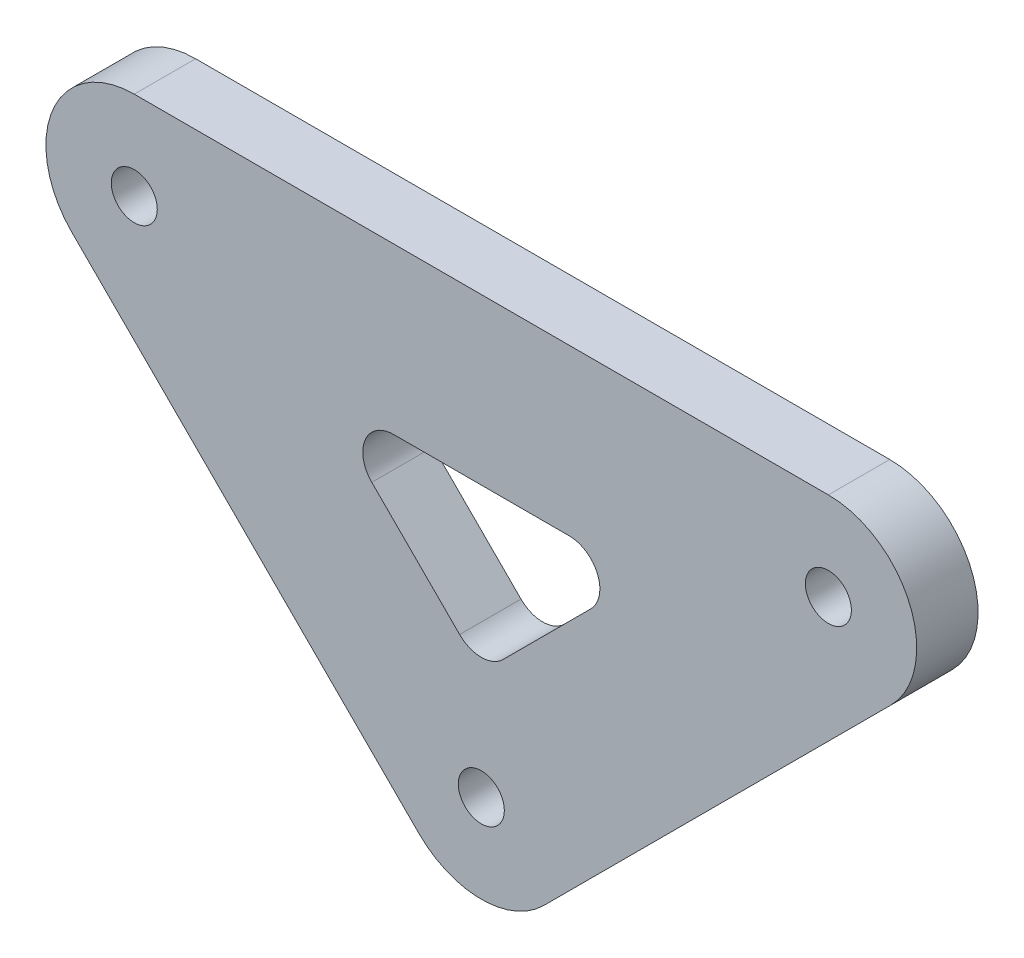
ISO-10303-21;
HEADER;
FILE_DESCRIPTION(('STEP AP214'),'2;1');
FILE_NAME('part.step','',(''),(''),'','','');
FILE_SCHEMA(('AUTOMOTIVE_DESIGN { 1 0 10303 214 1 1 1 1 }'));
ENDSEC;
DATA;
#1=APPLICATION_CONTEXT('core data for automotive mechanical design processes');
#2=APPLICATION_PROTOCOL_DEFINITION('international standard','automotive_design',2000,#1);
#3=PRODUCT_CONTEXT('',#1,'mechanical');
#4=PRODUCT('Part','Part','',(#3));
#5=PRODUCT_RELATED_PRODUCT_CATEGORY('part','',(#4));
#6=PRODUCT_DEFINITION_FORMATION('','',#4);
#7=PRODUCT_DEFINITION_CONTEXT('part definition',#1,'design');
#8=PRODUCT_DEFINITION('design','',#6,#7);
#9=PRODUCT_DEFINITION_SHAPE('','',#8);
#10=(LENGTH_UNIT() NAMED_UNIT(*) SI_UNIT(.MILLI.,.METRE.));
#11=(NAMED_UNIT(*) PLANE_ANGLE_UNIT() SI_UNIT($,.RADIAN.));
#12=(NAMED_UNIT(*) SI_UNIT($,.STERADIAN.) SOLID_ANGLE_UNIT());
#13=UNCERTAINTY_MEASURE_WITH_UNIT(LENGTH_MEASURE(1.E-05),#10,'distance_accuracy_value','');
#14=(GEOMETRIC_REPRESENTATION_CONTEXT(3) GLOBAL_UNCERTAINTY_ASSIGNED_CONTEXT((#13)) GLOBAL_UNIT_ASSIGNED_CONTEXT((#10,
#11,#12)) REPRESENTATION_CONTEXT('',''));
#15=CARTESIAN_POINT('',(0.,0.,0.));
#16=DIRECTION('',(0.,0.,1.));
#17=DIRECTION('',(1.,0.,0.));
#18=AXIS2_PLACEMENT_3D('',#15,#16,#17);
#19=CARTESIAN_POINT('',(0.,0.,4.));
#20=DIRECTION('',(0.,0.,1.));
#21=DIRECTION('',(1.,0.,0.));
#22=AXIS2_PLACEMENT_3D('',#19,#20,#21);
#23=PLANE('',#22);
#24=CARTESIAN_POINT('',(22.6274169979695,22.6274169979695,4.));
#25=DIRECTION('',(0.,0.,1.));
#26=DIRECTION('',(1.,0.,0.));
#27=AXIS2_PLACEMENT_3D('',#24,#25,#26);
#28=CIRCLE('',#27,1.5);
#29=CARTESIAN_POINT('',(24.1274169979695,22.6274169979695,4.));
#30=VERTEX_POINT('',#29);
#31=EDGE_CURVE('E155',#30,#30,#28,.T.);
#32=ORIENTED_EDGE('',*,*,#31,.F.);
#33=EDGE_LOOP('',(#32));
#34=FACE_BOUND('',#33,.T.);
#35=CARTESIAN_POINT('',(0.,0.,4.));
#36=DIRECTION('',(0.,0.,1.));
#37=DIRECTION('',(1.,0.,0.));
#38=AXIS2_PLACEMENT_3D('',#35,#36,#37);
#39=CIRCLE('',#38,1.5);
#40=CARTESIAN_POINT('',(1.49999999999999,0.,4.));
#41=VERTEX_POINT('',#40);
#42=EDGE_CURVE('E175',#41,#41,#39,.T.);
#43=ORIENTED_EDGE('',*,*,#42,.F.);
#44=EDGE_LOOP('',(#43));
#45=FACE_BOUND('',#44,.T.);
#46=CARTESIAN_POINT('',(0.,0.,4.));
#47=DIRECTION('',(0.,0.,1.));
#48=DIRECTION('',(1.,0.,0.));
#49=AXIS2_PLACEMENT_3D('',#46,#47,#48);
#50=CIRCLE('',#49,5.7605596096755);
#51=CARTESIAN_POINT('',(-4.07333076343089,-4.07333076343089,4.));
#52=VERTEX_POINT('',#51);
#53=CARTESIAN_POINT('',(4.07333076343086,-4.07333076343089,4.));
#54=VERTEX_POINT('',#53);
#55=EDGE_CURVE('E181',#52,#54,#50,.T.);
#56=ORIENTED_EDGE('',*,*,#55,.T.);
#57=DIRECTION('',(0.707106781186547,0.707106781186547,0.));
#58=VECTOR('',#57,1.);
#59=CARTESIAN_POINT('',(4.07333076343086,-4.07333076343089,4.));
#60=LINE('',#59,#58);
#61=CARTESIAN_POINT('',(26.7007477614004,18.5540862345386,4.));
#62=VERTEX_POINT('',#61);
#63=EDGE_CURVE('E184',#54,#62,#60,.T.);
#64=ORIENTED_EDGE('',*,*,#63,.T.);
#65=CARTESIAN_POINT('',(22.6274169979695,22.6274169979695,4.));
#66=DIRECTION('',(0.,0.,1.));
#67=DIRECTION('',(-1.,0.,0.));
#68=AXIS2_PLACEMENT_3D('',#65,#66,#67);
#69=CIRCLE('',#68,5.7605596096755);
#70=CARTESIAN_POINT('',(22.6274169979695,28.387976607645,4.));
#71=VERTEX_POINT('',#70);
#72=EDGE_CURVE('E187',#62,#71,#69,.T.);
#73=ORIENTED_EDGE('',*,*,#72,.T.);
#74=DIRECTION('',(-1.,0.,0.));
#75=VECTOR('',#74,1.);
#76=CARTESIAN_POINT('',(22.6274169979695,28.387976607645,4.));
#77=LINE('',#76,#75);
#78=CARTESIAN_POINT('',(-22.6274169979695,28.387976607645,4.));
#79=VERTEX_POINT('',#78);
#80=EDGE_CURVE('E189',#71,#79,#77,.T.);
#81=ORIENTED_EDGE('',*,*,#80,.T.);
#82=CARTESIAN_POINT('',(-22.6274169979695,22.6274169979695,4.));
#83=DIRECTION('',(0.,0.,1.));
#84=DIRECTION('',(-1.,0.,0.));
#85=AXIS2_PLACEMENT_3D('',#82,#83,#84);
#86=CIRCLE('',#85,5.7605596096755);
#87=CARTESIAN_POINT('',(-26.7007477614004,18.5540862345386,4.));
#88=VERTEX_POINT('',#87);
#89=EDGE_CURVE('E191',#79,#88,#86,.T.);
#90=ORIENTED_EDGE('',*,*,#89,.T.);
#91=DIRECTION('',(0.707106781186548,-0.707106781186547,0.));
#92=VECTOR('',#91,1.);
#93=CARTESIAN_POINT('',(-26.7007477614004,18.5540862345386,4.));
#94=LINE('',#93,#92);
#95=EDGE_CURVE('E193',#88,#52,#94,.T.);
#96=ORIENTED_EDGE('',*,*,#95,.T.);
#97=EDGE_LOOP('',(#56,#64,#73,#81,#90,#96));
#98=FACE_BOUND('',#97,.T.);
#99=DIRECTION('',(0.707106781186547,0.707106781186548,0.));
#100=VECTOR('',#99,1.);
#101=CARTESIAN_POINT('',(1.41421356237311,8.48528137423858,4.));
#102=LINE('',#101,#100);
#103=CARTESIAN_POINT('',(1.41421356237311,8.48528137423858,4.));
#104=VERTEX_POINT('',#103);
#105=CARTESIAN_POINT('',(7.14213562373092,14.2132034355964,4.));
#106=VERTEX_POINT('',#105);
#107=EDGE_CURVE('E129',#104,#106,#102,.T.);
#108=ORIENTED_EDGE('',*,*,#107,.F.);
#109=CARTESIAN_POINT('',(0.,9.89949493661167,4.));
#110=DIRECTION('',(0.,0.,1.));
#111=DIRECTION('',(1.,0.,0.));
#112=AXIS2_PLACEMENT_3D('',#109,#110,#111);
#113=CIRCLE('',#112,2.);
#114=CARTESIAN_POINT('',(-1.41421356237311,8.48528137423858,4.));
#115=VERTEX_POINT('',#114);
#116=EDGE_CURVE('E121',#115,#104,#113,.T.);
#117=ORIENTED_EDGE('',*,*,#116,.F.);
#118=DIRECTION('',(0.707106781186547,-0.707106781186548,0.));
#119=VECTOR('',#118,1.);
#120=CARTESIAN_POINT('',(-7.14213562373092,14.2132034355964,4.));
#121=LINE('',#120,#119);
#122=CARTESIAN_POINT('',(-7.14213562373092,14.2132034355964,4.));
#123=VERTEX_POINT('',#122);
#124=EDGE_CURVE('E152',#123,#115,#121,.T.);
#125=ORIENTED_EDGE('',*,*,#124,.F.);
#126=CARTESIAN_POINT('',(-5.72792206135786,15.6274169979695,4.));
#127=DIRECTION('',(0.,0.,1.));
#128=DIRECTION('',(1.,0.,0.));
#129=AXIS2_PLACEMENT_3D('',#126,#127,#128);
#130=CIRCLE('',#129,2.);
#131=CARTESIAN_POINT('',(-5.72792206135781,17.6274169979695,4.));
#132=VERTEX_POINT('',#131);
#133=EDGE_CURVE('E150',#132,#123,#130,.T.);
#134=ORIENTED_EDGE('',*,*,#133,.F.);
#135=DIRECTION('',(-1.,0.,0.));
#136=VECTOR('',#135,1.);
#137=CARTESIAN_POINT('',(5.72792206135781,17.6274169979695,4.));
#138=LINE('',#137,#136);
#139=CARTESIAN_POINT('',(5.72792206135781,17.6274169979695,4.));
#140=VERTEX_POINT('',#139);
#141=EDGE_CURVE('E145',#140,#132,#138,.T.);
#142=ORIENTED_EDGE('',*,*,#141,.F.);
#143=CARTESIAN_POINT('',(5.72792206135786,15.6274169979695,4.));
#144=DIRECTION('',(0.,0.,1.));
#145=DIRECTION('',(-1.,0.,0.));
#146=AXIS2_PLACEMENT_3D('',#143,#144,#145);
#147=CIRCLE('',#146,2.);
#148=EDGE_CURVE('E143',#106,#140,#147,.T.);
#149=ORIENTED_EDGE('',*,*,#148,.F.);
#150=EDGE_LOOP('',(#108,#117,#125,#134,#142,#149));
#151=FACE_BOUND('',#150,.T.);
#152=CARTESIAN_POINT('',(-22.6274169979695,22.6274169979695,4.));
#153=DIRECTION('',(0.,0.,1.));
#154=DIRECTION('',(1.,0.,0.));
#155=AXIS2_PLACEMENT_3D('',#152,#153,#154);
#156=CIRCLE('',#155,1.5);
#157=CARTESIAN_POINT('',(-21.1274169979695,22.6274169979695,4.));
#158=VERTEX_POINT('',#157);
#159=EDGE_CURVE('E301',#158,#158,#156,.T.);
#160=ORIENTED_EDGE('',*,*,#159,.F.);
#161=EDGE_LOOP('',(#160));
#162=FACE_BOUND('',#161,.T.);
#163=ADVANCED_FACE('F32',(#34,#45,#98,#151,#162),#23,.T.);
#164=CARTESIAN_POINT('',(0.,0.,0.));
#165=DIRECTION('',(0.,0.,1.));
#166=DIRECTION('',(1.,0.,0.));
#167=AXIS2_PLACEMENT_3D('',#164,#165,#166);
#168=PLANE('',#167);
#169=CARTESIAN_POINT('',(22.6274169979695,22.6274169979695,0.));
#170=DIRECTION('',(0.,0.,1.));
#171=DIRECTION('',(1.,0.,0.));
#172=AXIS2_PLACEMENT_3D('',#169,#170,#171);
#173=CIRCLE('',#172,1.5);
#174=CARTESIAN_POINT('',(24.1274169979695,22.6274169979695,0.));
#175=VERTEX_POINT('',#174);
#176=EDGE_CURVE('E307',#175,#175,#173,.T.);
#177=ORIENTED_EDGE('',*,*,#176,.T.);
#178=EDGE_LOOP('',(#177));
#179=FACE_BOUND('',#178,.T.);
#180=CARTESIAN_POINT('',(0.,0.,0.));
#181=DIRECTION('',(0.,0.,1.));
#182=DIRECTION('',(1.,0.,0.));
#183=AXIS2_PLACEMENT_3D('',#180,#181,#182);
#184=CIRCLE('',#183,1.5);
#185=CARTESIAN_POINT('',(1.49999999999999,0.,0.));
#186=VERTEX_POINT('',#185);
#187=EDGE_CURVE('E137',#186,#186,#184,.T.);
#188=ORIENTED_EDGE('',*,*,#187,.T.);
#189=EDGE_LOOP('',(#188));
#190=FACE_BOUND('',#189,.T.);
#191=CARTESIAN_POINT('',(0.,0.,0.));
#192=DIRECTION('',(0.,0.,1.));
#193=DIRECTION('',(1.,0.,0.));
#194=AXIS2_PLACEMENT_3D('',#191,#192,#193);
#195=CIRCLE('',#194,5.7605596096755);
#196=CARTESIAN_POINT('',(-4.07333076343089,-4.07333076343089,0.));
#197=VERTEX_POINT('',#196);
#198=CARTESIAN_POINT('',(4.07333076343086,-4.07333076343089,0.));
#199=VERTEX_POINT('',#198);
#200=EDGE_CURVE('E178',#197,#199,#195,.T.);
#201=ORIENTED_EDGE('',*,*,#200,.F.);
#202=DIRECTION('',(0.707106781186548,-0.707106781186547,0.));
#203=VECTOR('',#202,1.);
#204=CARTESIAN_POINT('',(-26.7007477614004,18.5540862345386,0.));
#205=LINE('',#204,#203);
#206=CARTESIAN_POINT('',(-26.7007477614004,18.5540862345386,0.));
#207=VERTEX_POINT('',#206);
#208=EDGE_CURVE('E185',#207,#197,#205,.T.);
#209=ORIENTED_EDGE('',*,*,#208,.F.);
#210=CARTESIAN_POINT('',(-22.6274169979695,22.6274169979695,0.));
#211=DIRECTION('',(0.,0.,1.));
#212=DIRECTION('',(-1.,0.,0.));
#213=AXIS2_PLACEMENT_3D('',#210,#211,#212);
#214=CIRCLE('',#213,5.7605596096755);
#215=CARTESIAN_POINT('',(-22.6274169979695,28.387976607645,0.));
#216=VERTEX_POINT('',#215);
#217=EDGE_CURVE('E204',#216,#207,#214,.T.);
#218=ORIENTED_EDGE('',*,*,#217,.F.);
#219=DIRECTION('',(-1.,0.,0.));
#220=VECTOR('',#219,1.);
#221=CARTESIAN_POINT('',(22.6274169979695,28.387976607645,0.));
#222=LINE('',#221,#220);
#223=CARTESIAN_POINT('',(22.6274169979695,28.387976607645,0.));
#224=VERTEX_POINT('',#223);
#225=EDGE_CURVE('E202',#224,#216,#222,.T.);
#226=ORIENTED_EDGE('',*,*,#225,.F.);
#227=CARTESIAN_POINT('',(22.6274169979695,22.6274169979695,0.));
#228=DIRECTION('',(0.,0.,1.));
#229=DIRECTION('',(-1.,0.,0.));
#230=AXIS2_PLACEMENT_3D('',#227,#228,#229);
#231=CIRCLE('',#230,5.7605596096755);
#232=CARTESIAN_POINT('',(26.7007477614004,18.5540862345386,0.));
#233=VERTEX_POINT('',#232);
#234=EDGE_CURVE('E200',#233,#224,#231,.T.);
#235=ORIENTED_EDGE('',*,*,#234,.F.);
#236=DIRECTION('',(0.707106781186547,0.707106781186547,0.));
#237=VECTOR('',#236,1.);
#238=CARTESIAN_POINT('',(4.07333076343086,-4.07333076343089,0.));
#239=LINE('',#238,#237);
#240=EDGE_CURVE('E198',#199,#233,#239,.T.);
#241=ORIENTED_EDGE('',*,*,#240,.F.);
#242=EDGE_LOOP('',(#201,#209,#218,#226,#235,#241));
#243=FACE_BOUND('',#242,.T.);
#244=CARTESIAN_POINT('',(0.,9.89949493661167,0.));
#245=DIRECTION('',(0.,0.,1.));
#246=DIRECTION('',(1.,0.,0.));
#247=AXIS2_PLACEMENT_3D('',#244,#245,#246);
#248=CIRCLE('',#247,2.);
#249=CARTESIAN_POINT('',(-1.41421356237311,8.48528137423858,0.));
#250=VERTEX_POINT('',#249);
#251=CARTESIAN_POINT('',(1.41421356237311,8.48528137423858,0.));
#252=VERTEX_POINT('',#251);
#253=EDGE_CURVE('E55',#250,#252,#248,.T.);
#254=ORIENTED_EDGE('',*,*,#253,.T.);
#255=DIRECTION('',(0.707106781186547,0.707106781186548,0.));
#256=VECTOR('',#255,1.);
#257=CARTESIAN_POINT('',(1.41421356237311,8.48528137423858,0.));
#258=LINE('',#257,#256);
#259=CARTESIAN_POINT('',(7.14213562373092,14.2132034355964,0.));
#260=VERTEX_POINT('',#259);
#261=EDGE_CURVE('E136',#252,#260,#258,.T.);
#262=ORIENTED_EDGE('',*,*,#261,.T.);
#263=CARTESIAN_POINT('',(5.72792206135786,15.6274169979695,0.));
#264=DIRECTION('',(0.,0.,1.));
#265=DIRECTION('',(-1.,0.,0.));
#266=AXIS2_PLACEMENT_3D('',#263,#264,#265);
#267=CIRCLE('',#266,2.);
#268=CARTESIAN_POINT('',(5.72792206135781,17.6274169979695,0.));
#269=VERTEX_POINT('',#268);
#270=EDGE_CURVE('E157',#260,#269,#267,.T.);
#271=ORIENTED_EDGE('',*,*,#270,.T.);
#272=DIRECTION('',(-1.,0.,0.));
#273=VECTOR('',#272,1.);
#274=CARTESIAN_POINT('',(5.72792206135781,17.6274169979695,0.));
#275=LINE('',#274,#273);
#276=CARTESIAN_POINT('',(-5.72792206135781,17.6274169979695,0.));
#277=VERTEX_POINT('',#276);
#278=EDGE_CURVE('E160',#269,#277,#275,.T.);
#279=ORIENTED_EDGE('',*,*,#278,.T.);
#280=CARTESIAN_POINT('',(-5.72792206135786,15.6274169979695,0.));
#281=DIRECTION('',(0.,0.,1.));
#282=DIRECTION('',(1.,0.,0.));
#283=AXIS2_PLACEMENT_3D('',#280,#281,#282);
#284=CIRCLE('',#283,2.);
#285=CARTESIAN_POINT('',(-7.14213562373092,14.2132034355964,0.));
#286=VERTEX_POINT('',#285);
#287=EDGE_CURVE('E163',#277,#286,#284,.T.);
#288=ORIENTED_EDGE('',*,*,#287,.T.);
#289=DIRECTION('',(0.707106781186547,-0.707106781186548,0.));
#290=VECTOR('',#289,1.);
#291=CARTESIAN_POINT('',(-7.14213562373092,14.2132034355964,0.));
#292=LINE('',#291,#290);
#293=EDGE_CURVE('E130',#286,#250,#292,.T.);
#294=ORIENTED_EDGE('',*,*,#293,.T.);
#295=EDGE_LOOP('',(#254,#262,#271,#279,#288,#294));
#296=FACE_BOUND('',#295,.T.);
#297=CARTESIAN_POINT('',(-22.6274169979695,22.6274169979695,0.));
#298=DIRECTION('',(0.,0.,1.));
#299=DIRECTION('',(1.,0.,0.));
#300=AXIS2_PLACEMENT_3D('',#297,#298,#299);
#301=CIRCLE('',#300,1.5);
#302=CARTESIAN_POINT('',(-21.1274169979695,22.6274169979695,0.));
#303=VERTEX_POINT('',#302);
#304=EDGE_CURVE('E304',#303,#303,#301,.T.);
#305=ORIENTED_EDGE('',*,*,#304,.T.);
#306=EDGE_LOOP('',(#305));
#307=FACE_BOUND('',#306,.T.);
#308=ADVANCED_FACE('F228',(#179,#190,#243,#296,#307),#168,.F.);
#309=CARTESIAN_POINT('',(0.,0.,4.));
#310=DIRECTION('',(0.,0.,-1.));
#311=DIRECTION('',(-1.,0.,0.));
#312=AXIS2_PLACEMENT_3D('',#309,#310,#311);
#313=CYLINDRICAL_SURFACE('',#312,5.7605596096755);
#314=ORIENTED_EDGE('',*,*,#200,.T.);
#315=DIRECTION('',(0.,0.,-1.));
#316=VECTOR('',#315,1.);
#317=CARTESIAN_POINT('',(4.07333076343086,-4.07333076343089,4.));
#318=LINE('',#317,#316);
#319=EDGE_CURVE('E11',#54,#199,#318,.T.);
#320=ORIENTED_EDGE('',*,*,#319,.F.);
#321=ORIENTED_EDGE('',*,*,#55,.F.);
#322=DIRECTION('',(0.,0.,-1.));
#323=VECTOR('',#322,1.);
#324=CARTESIAN_POINT('',(-4.07333076343089,-4.07333076343089,4.));
#325=LINE('',#324,#323);
#326=EDGE_CURVE('E195',#52,#197,#325,.T.);
#327=ORIENTED_EDGE('',*,*,#326,.T.);
#328=EDGE_LOOP('',(#314,#320,#321,#327));
#329=FACE_BOUND('',#328,.T.);
#330=ADVANCED_FACE('F34',(#329),#313,.T.);
#331=CARTESIAN_POINT('',(4.07333076343086,-4.07333076343089,4.));
#332=DIRECTION('',(-0.707106781186547,0.707106781186547,0.));
#333=DIRECTION('',(-0.707106781186548,-0.707106781186548,0.));
#334=AXIS2_PLACEMENT_3D('',#331,#332,#333);
#335=PLANE('',#334);
#336=ORIENTED_EDGE('',*,*,#240,.T.);
#337=DIRECTION('',(0.,0.,-1.));
#338=VECTOR('',#337,1.);
#339=CARTESIAN_POINT('',(26.7007477614004,18.5540862345386,4.));
#340=LINE('',#339,#338);
#341=EDGE_CURVE('E40',#62,#233,#340,.T.);
#342=ORIENTED_EDGE('',*,*,#341,.F.);
#343=ORIENTED_EDGE('',*,*,#63,.F.);
#344=ORIENTED_EDGE('',*,*,#319,.T.);
#345=EDGE_LOOP('',(#336,#342,#343,#344));
#346=FACE_BOUND('',#345,.T.);
#347=ADVANCED_FACE('F245',(#346),#335,.F.);
#348=CARTESIAN_POINT('',(22.6274169979695,22.6274169979695,4.));
#349=DIRECTION('',(0.,0.,-1.));
#350=DIRECTION('',(-1.,0.,0.));
#351=AXIS2_PLACEMENT_3D('',#348,#349,#350);
#352=CYLINDRICAL_SURFACE('',#351,5.7605596096755);
#353=ORIENTED_EDGE('',*,*,#234,.T.);
#354=DIRECTION('',(0.,0.,-1.));
#355=VECTOR('',#354,1.);
#356=CARTESIAN_POINT('',(22.6274169979695,28.387976607645,4.));
#357=LINE('',#356,#355);
#358=EDGE_CURVE('E215',#71,#224,#357,.T.);
#359=ORIENTED_EDGE('',*,*,#358,.F.);
#360=ORIENTED_EDGE('',*,*,#72,.F.);
#361=ORIENTED_EDGE('',*,*,#341,.T.);
#362=EDGE_LOOP('',(#353,#359,#360,#361));
#363=FACE_BOUND('',#362,.T.);
#364=ADVANCED_FACE('F222',(#363),#352,.T.);
#365=CARTESIAN_POINT('',(22.6274169979695,28.387976607645,4.));
#366=DIRECTION('',(0.,-1.,0.));
#367=DIRECTION('',(1.,0.,0.));
#368=AXIS2_PLACEMENT_3D('',#365,#366,#367);
#369=PLANE('',#368);
#370=ORIENTED_EDGE('',*,*,#225,.T.);
#371=DIRECTION('',(0.,0.,-1.));
#372=VECTOR('',#371,1.);
#373=CARTESIAN_POINT('',(-22.6274169979695,28.387976607645,4.));
#374=LINE('',#373,#372);
#375=EDGE_CURVE('E212',#79,#216,#374,.T.);
#376=ORIENTED_EDGE('',*,*,#375,.F.);
#377=ORIENTED_EDGE('',*,*,#80,.F.);
#378=ORIENTED_EDGE('',*,*,#358,.T.);
#379=EDGE_LOOP('',(#370,#376,#377,#378));
#380=FACE_BOUND('',#379,.T.);
#381=ADVANCED_FACE('F234',(#380),#369,.F.);
#382=CARTESIAN_POINT('',(-22.6274169979695,22.6274169979695,4.));
#383=DIRECTION('',(0.,0.,-1.));
#384=DIRECTION('',(-1.,0.,0.));
#385=AXIS2_PLACEMENT_3D('',#382,#383,#384);
#386=CYLINDRICAL_SURFACE('',#385,5.7605596096755);
#387=ORIENTED_EDGE('',*,*,#217,.T.);
#388=DIRECTION('',(0.,0.,-1.));
#389=VECTOR('',#388,1.);
#390=CARTESIAN_POINT('',(-26.7007477614004,18.5540862345386,4.));
#391=LINE('',#390,#389);
#392=EDGE_CURVE('E209',#88,#207,#391,.T.);
#393=ORIENTED_EDGE('',*,*,#392,.F.);
#394=ORIENTED_EDGE('',*,*,#89,.F.);
#395=ORIENTED_EDGE('',*,*,#375,.T.);
#396=EDGE_LOOP('',(#387,#393,#394,#395));
#397=FACE_BOUND('',#396,.T.);
#398=ADVANCED_FACE('F238',(#397),#386,.T.);
#399=CARTESIAN_POINT('',(-26.7007477614004,18.5540862345386,4.));
#400=DIRECTION('',(0.707106781186547,0.707106781186548,0.));
#401=DIRECTION('',(-0.707106781186548,0.707106781186547,0.));
#402=AXIS2_PLACEMENT_3D('',#399,#400,#401);
#403=PLANE('',#402);
#404=ORIENTED_EDGE('',*,*,#208,.T.);
#405=ORIENTED_EDGE('',*,*,#326,.F.);
#406=ORIENTED_EDGE('',*,*,#95,.F.);
#407=ORIENTED_EDGE('',*,*,#392,.T.);
#408=EDGE_LOOP('',(#404,#405,#406,#407));
#409=FACE_BOUND('',#408,.T.);
#410=ADVANCED_FACE('F248',(#409),#403,.F.);
#411=CARTESIAN_POINT('',(0.,0.,4.));
#412=DIRECTION('',(0.,0.,-1.));
#413=DIRECTION('',(-1.,0.,0.));
#414=AXIS2_PLACEMENT_3D('',#411,#412,#413);
#415=CYLINDRICAL_SURFACE('',#414,1.5);
#416=ORIENTED_EDGE('',*,*,#42,.T.);
#417=EDGE_LOOP('',(#416));
#418=FACE_BOUND('',#417,.T.);
#419=ORIENTED_EDGE('',*,*,#187,.F.);
#420=EDGE_LOOP('',(#419));
#421=FACE_BOUND('',#420,.T.);
#422=ADVANCED_FACE('F250',(#418,#421),#415,.F.);
#423=CARTESIAN_POINT('',(0.,9.89949493661167,4.));
#424=DIRECTION('',(0.,0.,-1.));
#425=DIRECTION('',(-1.,0.,0.));
#426=AXIS2_PLACEMENT_3D('',#423,#424,#425);
#427=CYLINDRICAL_SURFACE('',#426,2.);
#428=ORIENTED_EDGE('',*,*,#253,.F.);
#429=DIRECTION('',(0.,0.,-1.));
#430=VECTOR('',#429,1.);
#431=CARTESIAN_POINT('',(-1.41421356237311,8.48528137423858,4.));
#432=LINE('',#431,#430);
#433=EDGE_CURVE('E125',#115,#250,#432,.T.);
#434=ORIENTED_EDGE('',*,*,#433,.F.);
#435=ORIENTED_EDGE('',*,*,#116,.T.);
#436=DIRECTION('',(0.,0.,-1.));
#437=VECTOR('',#436,1.);
#438=CARTESIAN_POINT('',(1.41421356237311,8.48528137423858,4.));
#439=LINE('',#438,#437);
#440=EDGE_CURVE('E124',#104,#252,#439,.T.);
#441=ORIENTED_EDGE('',*,*,#440,.T.);
#442=EDGE_LOOP('',(#428,#434,#435,#441));
#443=FACE_BOUND('',#442,.T.);
#444=ADVANCED_FACE('F123',(#443),#427,.F.);
#445=CARTESIAN_POINT('',(1.41421356237311,8.48528137423858,4.));
#446=DIRECTION('',(-0.707106781186548,0.707106781186547,0.));
#447=DIRECTION('',(-0.707106781186547,-0.707106781186548,0.));
#448=AXIS2_PLACEMENT_3D('',#445,#446,#447);
#449=PLANE('',#448);
#450=ORIENTED_EDGE('',*,*,#261,.F.);
#451=ORIENTED_EDGE('',*,*,#440,.F.);
#452=ORIENTED_EDGE('',*,*,#107,.T.);
#453=DIRECTION('',(0.,0.,-1.));
#454=VECTOR('',#453,1.);
#455=CARTESIAN_POINT('',(7.14213562373092,14.2132034355964,4.));
#456=LINE('',#455,#454);
#457=EDGE_CURVE('E138',#106,#260,#456,.T.);
#458=ORIENTED_EDGE('',*,*,#457,.T.);
#459=EDGE_LOOP('',(#450,#451,#452,#458));
#460=FACE_BOUND('',#459,.T.);
#461=ADVANCED_FACE('F133',(#460),#449,.T.);
#462=CARTESIAN_POINT('',(5.72792206135786,15.6274169979695,4.));
#463=DIRECTION('',(0.,0.,-1.));
#464=DIRECTION('',(-1.,0.,0.));
#465=AXIS2_PLACEMENT_3D('',#462,#463,#464);
#466=CYLINDRICAL_SURFACE('',#465,2.);
#467=ORIENTED_EDGE('',*,*,#270,.F.);
#468=ORIENTED_EDGE('',*,*,#457,.F.);
#469=ORIENTED_EDGE('',*,*,#148,.T.);
#470=DIRECTION('',(0.,0.,-1.));
#471=VECTOR('',#470,1.);
#472=CARTESIAN_POINT('',(5.72792206135781,17.6274169979695,4.));
#473=LINE('',#472,#471);
#474=EDGE_CURVE('E172',#140,#269,#473,.T.);
#475=ORIENTED_EDGE('',*,*,#474,.T.);
#476=EDGE_LOOP('',(#467,#468,#469,#475));
#477=FACE_BOUND('',#476,.T.);
#478=ADVANCED_FACE('F274',(#477),#466,.F.);
#479=CARTESIAN_POINT('',(5.72792206135781,17.6274169979695,4.));
#480=DIRECTION('',(0.,-1.,0.));
#481=DIRECTION('',(0.,0.,-1.));
#482=AXIS2_PLACEMENT_3D('',#479,#480,#481);
#483=PLANE('',#482);
#484=ORIENTED_EDGE('',*,*,#278,.F.);
#485=ORIENTED_EDGE('',*,*,#474,.F.);
#486=ORIENTED_EDGE('',*,*,#141,.T.);
#487=DIRECTION('',(0.,0.,-1.));
#488=VECTOR('',#487,1.);
#489=CARTESIAN_POINT('',(-5.72792206135781,17.6274169979695,4.));
#490=LINE('',#489,#488);
#491=EDGE_CURVE('E170',#132,#277,#490,.T.);
#492=ORIENTED_EDGE('',*,*,#491,.T.);
#493=EDGE_LOOP('',(#484,#485,#486,#492));
#494=FACE_BOUND('',#493,.T.);
#495=ADVANCED_FACE('F277',(#494),#483,.T.);
#496=CARTESIAN_POINT('',(-5.72792206135786,15.6274169979695,4.));
#497=DIRECTION('',(0.,0.,-1.));
#498=DIRECTION('',(-1.,0.,0.));
#499=AXIS2_PLACEMENT_3D('',#496,#497,#498);
#500=CYLINDRICAL_SURFACE('',#499,2.);
#501=ORIENTED_EDGE('',*,*,#287,.F.);
#502=ORIENTED_EDGE('',*,*,#491,.F.);
#503=ORIENTED_EDGE('',*,*,#133,.T.);
#504=DIRECTION('',(0.,0.,-1.));
#505=VECTOR('',#504,1.);
#506=CARTESIAN_POINT('',(-7.14213562373092,14.2132034355964,4.));
#507=LINE('',#506,#505);
#508=EDGE_CURVE('E47',#123,#286,#507,.T.);
#509=ORIENTED_EDGE('',*,*,#508,.T.);
#510=EDGE_LOOP('',(#501,#502,#503,#509));
#511=FACE_BOUND('',#510,.T.);
#512=ADVANCED_FACE('F281',(#511),#500,.F.);
#513=CARTESIAN_POINT('',(-7.14213562373092,14.2132034355964,4.));
#514=DIRECTION('',(0.707106781186548,0.707106781186547,0.));
#515=DIRECTION('',(-0.707106781186547,0.707106781186548,0.));
#516=AXIS2_PLACEMENT_3D('',#513,#514,#515);
#517=PLANE('',#516);
#518=ORIENTED_EDGE('',*,*,#293,.F.);
#519=ORIENTED_EDGE('',*,*,#508,.F.);
#520=ORIENTED_EDGE('',*,*,#124,.T.);
#521=ORIENTED_EDGE('',*,*,#433,.T.);
#522=EDGE_LOOP('',(#518,#519,#520,#521));
#523=FACE_BOUND('',#522,.T.);
#524=ADVANCED_FACE('F285',(#523),#517,.T.);
#525=CARTESIAN_POINT('',(22.6274169979695,22.6274169979695,4.));
#526=DIRECTION('',(0.,0.,-1.));
#527=DIRECTION('',(-1.,0.,0.));
#528=AXIS2_PLACEMENT_3D('',#525,#526,#527);
#529=CYLINDRICAL_SURFACE('',#528,1.5);
#530=ORIENTED_EDGE('',*,*,#31,.T.);
#531=EDGE_LOOP('',(#530));
#532=FACE_BOUND('',#531,.T.);
#533=ORIENTED_EDGE('',*,*,#176,.F.);
#534=EDGE_LOOP('',(#533));
#535=FACE_BOUND('',#534,.T.);
#536=ADVANCED_FACE('F289',(#532,#535),#529,.F.);
#537=CARTESIAN_POINT('',(-22.6274169979695,22.6274169979695,4.));
#538=DIRECTION('',(0.,0.,-1.));
#539=DIRECTION('',(-1.,0.,0.));
#540=AXIS2_PLACEMENT_3D('',#537,#538,#539);
#541=CYLINDRICAL_SURFACE('',#540,1.5);
#542=ORIENTED_EDGE('',*,*,#159,.T.);
#543=EDGE_LOOP('',(#542));
#544=FACE_BOUND('',#543,.T.);
#545=ORIENTED_EDGE('',*,*,#304,.F.);
#546=EDGE_LOOP('',(#545));
#547=FACE_BOUND('',#546,.T.);
#548=ADVANCED_FACE('F292',(#544,#547),#541,.F.);
#549=CLOSED_SHELL('',(#163,#308,#330,#347,#364,#381,#398,#410,#422,#444,#461,#478,#495,#512,
#524,#536,#548));
#550=MANIFOLD_SOLID_BREP('B2',#549);
#551=ADVANCED_BREP_SHAPE_REPRESENTATION('',(#18,#550),#14);
#552=SHAPE_DEFINITION_REPRESENTATION(#9,#551);
ENDSEC;
END-ISO-10303-21;
